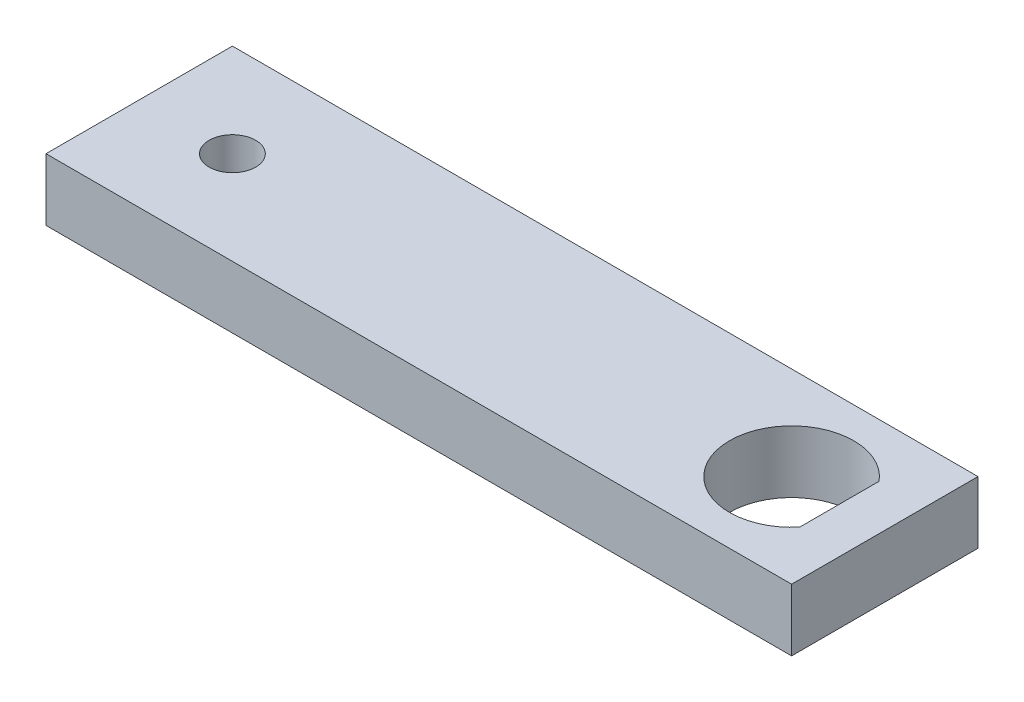
ISO-10303-21;
HEADER;
FILE_DESCRIPTION(('STEP AP214'),'2;1');
FILE_NAME('part.step','',(''),(''),'','','');
FILE_SCHEMA(('AUTOMOTIVE_DESIGN { 1 0 10303 214 1 1 1 1 }'));
ENDSEC;
DATA;
#1=APPLICATION_CONTEXT('core data for automotive mechanical design processes');
#2=APPLICATION_PROTOCOL_DEFINITION('international standard','automotive_design',2000,#1);
#3=PRODUCT_CONTEXT('',#1,'mechanical');
#4=PRODUCT('Part','Part','',(#3));
#5=PRODUCT_RELATED_PRODUCT_CATEGORY('part','',(#4));
#6=PRODUCT_DEFINITION_FORMATION('','',#4);
#7=PRODUCT_DEFINITION_CONTEXT('part definition',#1,'design');
#8=PRODUCT_DEFINITION('design','',#6,#7);
#9=PRODUCT_DEFINITION_SHAPE('','',#8);
#10=(LENGTH_UNIT() NAMED_UNIT(*) SI_UNIT(.MILLI.,.METRE.));
#11=(NAMED_UNIT(*) PLANE_ANGLE_UNIT() SI_UNIT($,.RADIAN.));
#12=(NAMED_UNIT(*) SI_UNIT($,.STERADIAN.) SOLID_ANGLE_UNIT());
#13=UNCERTAINTY_MEASURE_WITH_UNIT(LENGTH_MEASURE(1.E-05),#10,'distance_accuracy_value','');
#14=(GEOMETRIC_REPRESENTATION_CONTEXT(3) GLOBAL_UNCERTAINTY_ASSIGNED_CONTEXT((#13)) GLOBAL_UNIT_ASSIGNED_CONTEXT((#10,
#11,#12)) REPRESENTATION_CONTEXT('',''));
#15=CARTESIAN_POINT('',(0.,0.,0.));
#16=DIRECTION('',(0.,0.,1.));
#17=DIRECTION('',(1.,0.,0.));
#18=AXIS2_PLACEMENT_3D('',#15,#16,#17);
#19=CARTESIAN_POINT('',(0.,0.,19.05));
#20=DIRECTION('',(-1.,0.,0.));
#21=DIRECTION('',(0.,0.,1.));
#22=AXIS2_PLACEMENT_3D('',#19,#20,#21);
#23=PLANE('',#22);
#24=DIRECTION('',(0.,1.,0.));
#25=VECTOR('',#24,1.);
#26=CARTESIAN_POINT('',(0.,0.,0.));
#27=LINE('',#26,#25);
#28=CARTESIAN_POINT('',(0.,0.,0.));
#29=VERTEX_POINT('',#28);
#30=CARTESIAN_POINT('',(0.,6.35000000000001,0.));
#31=VERTEX_POINT('',#30);
#32=EDGE_CURVE('E111',#29,#31,#27,.T.);
#33=ORIENTED_EDGE('',*,*,#32,.F.);
#34=DIRECTION('',(0.,0.,-1.));
#35=VECTOR('',#34,1.);
#36=CARTESIAN_POINT('',(0.,0.,19.05));
#37=LINE('',#36,#35);
#38=CARTESIAN_POINT('',(0.,0.,19.05));
#39=VERTEX_POINT('',#38);
#40=EDGE_CURVE('E11',#39,#29,#37,.T.);
#41=ORIENTED_EDGE('',*,*,#40,.F.);
#42=DIRECTION('',(0.,1.,0.));
#43=VECTOR('',#42,1.);
#44=CARTESIAN_POINT('',(0.,0.,19.05));
#45=LINE('',#44,#43);
#46=CARTESIAN_POINT('',(0.,6.35000000000001,19.05));
#47=VERTEX_POINT('',#46);
#48=EDGE_CURVE('E113',#39,#47,#45,.T.);
#49=ORIENTED_EDGE('',*,*,#48,.T.);
#50=DIRECTION('',(0.,0.,-1.));
#51=VECTOR('',#50,1.);
#52=CARTESIAN_POINT('',(0.,6.35000000000001,19.05));
#53=LINE('',#52,#51);
#54=EDGE_CURVE('E41',#47,#31,#53,.T.);
#55=ORIENTED_EDGE('',*,*,#54,.T.);
#56=EDGE_LOOP('',(#33,#41,#49,#55));
#57=FACE_BOUND('',#56,.T.);
#58=ADVANCED_FACE('F38',(#57),#23,.T.);
#59=CARTESIAN_POINT('',(0.,0.,19.05));
#60=DIRECTION('',(0.,1.,0.));
#61=DIRECTION('',(0.,0.,1.));
#62=AXIS2_PLACEMENT_3D('',#59,#60,#61);
#63=PLANE('',#62);
#64=CARTESIAN_POINT('',(9.525,0.,9.525));
#65=DIRECTION('',(0.,1.,0.));
#66=DIRECTION('',(-1.,0.,0.));
#67=AXIS2_PLACEMENT_3D('',#64,#65,#66);
#68=CIRCLE('',#67,2.38125);
#69=CARTESIAN_POINT('',(7.14375,0.,9.525));
#70=VERTEX_POINT('',#69);
#71=EDGE_CURVE('E109',#70,#70,#68,.T.);
#72=ORIENTED_EDGE('',*,*,#71,.T.);
#73=EDGE_LOOP('',(#72));
#74=FACE_BOUND('',#73,.T.);
#75=DIRECTION('',(0.,0.,1.));
#76=VECTOR('',#75,1.);
#77=CARTESIAN_POINT('',(71.5645,0.,5.47342132619889));
#78=LINE('',#77,#76);
#79=CARTESIAN_POINT('',(71.5645,0.,5.47342132619889));
#80=VERTEX_POINT('',#79);
#81=CARTESIAN_POINT('',(71.5645,0.,13.5765786738011));
#82=VERTEX_POINT('',#81);
#83=EDGE_CURVE('E90',#80,#82,#78,.T.);
#84=ORIENTED_EDGE('',*,*,#83,.F.);
#85=CARTESIAN_POINT('',(66.675,0.,9.525));
#86=DIRECTION('',(0.,1.,0.));
#87=DIRECTION('',(-1.,0.,0.));
#88=AXIS2_PLACEMENT_3D('',#85,#86,#87);
#89=CIRCLE('',#88,6.35);
#90=EDGE_CURVE('E54',#80,#82,#89,.T.);
#91=ORIENTED_EDGE('',*,*,#90,.T.);
#92=EDGE_LOOP('',(#84,#91));
#93=FACE_BOUND('',#92,.T.);
#94=DIRECTION('',(1.,0.,0.));
#95=VECTOR('',#94,1.);
#96=CARTESIAN_POINT('',(0.,0.,0.));
#97=LINE('',#96,#95);
#98=CARTESIAN_POINT('',(76.2,0.,0.));
#99=VERTEX_POINT('',#98);
#100=EDGE_CURVE('E117',#29,#99,#97,.T.);
#101=ORIENTED_EDGE('',*,*,#100,.T.);
#102=DIRECTION('',(0.,0.,-1.));
#103=VECTOR('',#102,1.);
#104=CARTESIAN_POINT('',(76.2,0.,19.05));
#105=LINE('',#104,#103);
#106=CARTESIAN_POINT('',(76.2,0.,19.05));
#107=VERTEX_POINT('',#106);
#108=EDGE_CURVE('E46',#107,#99,#105,.T.);
#109=ORIENTED_EDGE('',*,*,#108,.F.);
#110=DIRECTION('',(1.,0.,0.));
#111=VECTOR('',#110,1.);
#112=CARTESIAN_POINT('',(0.,0.,19.05));
#113=LINE('',#112,#111);
#114=EDGE_CURVE('E122',#39,#107,#113,.T.);
#115=ORIENTED_EDGE('',*,*,#114,.F.);
#116=ORIENTED_EDGE('',*,*,#40,.T.);
#117=EDGE_LOOP('',(#101,#109,#115,#116));
#118=FACE_BOUND('',#117,.T.);
#119=ADVANCED_FACE('F100',(#74,#93,#118),#63,.F.);
#120=CARTESIAN_POINT('',(76.2,6.34999999999999,19.05));
#121=DIRECTION('',(1.,0.,0.));
#122=DIRECTION('',(0.,0.,-1.));
#123=AXIS2_PLACEMENT_3D('',#120,#121,#122);
#124=PLANE('',#123);
#125=DIRECTION('',(0.,-1.,0.));
#126=VECTOR('',#125,1.);
#127=CARTESIAN_POINT('',(76.2,6.34999999999999,0.));
#128=LINE('',#127,#126);
#129=CARTESIAN_POINT('',(76.2,6.34999999999999,0.));
#130=VERTEX_POINT('',#129);
#131=EDGE_CURVE('E129',#130,#99,#128,.T.);
#132=ORIENTED_EDGE('',*,*,#131,.F.);
#133=DIRECTION('',(0.,0.,-1.));
#134=VECTOR('',#133,1.);
#135=CARTESIAN_POINT('',(76.2,6.34999999999999,19.05));
#136=LINE('',#135,#134);
#137=CARTESIAN_POINT('',(76.2,6.34999999999999,19.05));
#138=VERTEX_POINT('',#137);
#139=EDGE_CURVE('E135',#138,#130,#136,.T.);
#140=ORIENTED_EDGE('',*,*,#139,.F.);
#141=DIRECTION('',(0.,-1.,0.));
#142=VECTOR('',#141,1.);
#143=CARTESIAN_POINT('',(76.2,6.34999999999999,19.05));
#144=LINE('',#143,#142);
#145=EDGE_CURVE('E119',#138,#107,#144,.T.);
#146=ORIENTED_EDGE('',*,*,#145,.T.);
#147=ORIENTED_EDGE('',*,*,#108,.T.);
#148=EDGE_LOOP('',(#132,#140,#146,#147));
#149=FACE_BOUND('',#148,.T.);
#150=ADVANCED_FACE('F154',(#149),#124,.T.);
#151=CARTESIAN_POINT('',(76.2,6.34999999999999,19.05));
#152=DIRECTION('',(0.,-1.,0.));
#153=DIRECTION('',(1.,0.,0.));
#154=AXIS2_PLACEMENT_3D('',#151,#152,#153);
#155=PLANE('',#154);
#156=CARTESIAN_POINT('',(9.525,6.35000000000001,9.525));
#157=DIRECTION('',(0.,1.,0.));
#158=DIRECTION('',(-1.,0.,0.));
#159=AXIS2_PLACEMENT_3D('',#156,#157,#158);
#160=CIRCLE('',#159,2.38125);
#161=CARTESIAN_POINT('',(7.14375,6.35000000000001,9.525));
#162=VERTEX_POINT('',#161);
#163=EDGE_CURVE('E106',#162,#162,#160,.T.);
#164=ORIENTED_EDGE('',*,*,#163,.F.);
#165=EDGE_LOOP('',(#164));
#166=FACE_BOUND('',#165,.T.);
#167=DIRECTION('',(0.,0.,1.));
#168=VECTOR('',#167,1.);
#169=CARTESIAN_POINT('',(71.5645,6.35,5.47342132619889));
#170=LINE('',#169,#168);
#171=CARTESIAN_POINT('',(71.5645,6.35,5.47342132619889));
#172=VERTEX_POINT('',#171);
#173=CARTESIAN_POINT('',(71.5645,6.34999999999999,13.5765786738011));
#174=VERTEX_POINT('',#173);
#175=EDGE_CURVE('E102',#172,#174,#170,.T.);
#176=ORIENTED_EDGE('',*,*,#175,.T.);
#177=CARTESIAN_POINT('',(66.675,6.35,9.525));
#178=DIRECTION('',(0.,1.,0.));
#179=DIRECTION('',(-1.,0.,0.));
#180=AXIS2_PLACEMENT_3D('',#177,#178,#179);
#181=CIRCLE('',#180,6.35);
#182=EDGE_CURVE('E59',#172,#174,#181,.T.);
#183=ORIENTED_EDGE('',*,*,#182,.F.);
#184=EDGE_LOOP('',(#176,#183));
#185=FACE_BOUND('',#184,.T.);
#186=DIRECTION('',(-1.,0.,0.));
#187=VECTOR('',#186,1.);
#188=CARTESIAN_POINT('',(76.2,6.34999999999999,0.));
#189=LINE('',#188,#187);
#190=EDGE_CURVE('E126',#130,#31,#189,.T.);
#191=ORIENTED_EDGE('',*,*,#190,.T.);
#192=ORIENTED_EDGE('',*,*,#54,.F.);
#193=DIRECTION('',(-1.,0.,0.));
#194=VECTOR('',#193,1.);
#195=CARTESIAN_POINT('',(76.2,6.34999999999999,19.05));
#196=LINE('',#195,#194);
#197=EDGE_CURVE('E116',#138,#47,#196,.T.);
#198=ORIENTED_EDGE('',*,*,#197,.F.);
#199=ORIENTED_EDGE('',*,*,#139,.T.);
#200=EDGE_LOOP('',(#191,#192,#198,#199));
#201=FACE_BOUND('',#200,.T.);
#202=ADVANCED_FACE('F143',(#166,#185,#201),#155,.F.);
#203=CARTESIAN_POINT('',(0.,0.,19.05));
#204=DIRECTION('',(0.,0.,-1.));
#205=DIRECTION('',(-1.,0.,0.));
#206=AXIS2_PLACEMENT_3D('',#203,#204,#205);
#207=PLANE('',#206);
#208=ORIENTED_EDGE('',*,*,#48,.F.);
#209=ORIENTED_EDGE('',*,*,#114,.T.);
#210=ORIENTED_EDGE('',*,*,#145,.F.);
#211=ORIENTED_EDGE('',*,*,#197,.T.);
#212=EDGE_LOOP('',(#208,#209,#210,#211));
#213=FACE_BOUND('',#212,.T.);
#214=ADVANCED_FACE('F152',(#213),#207,.F.);
#215=CARTESIAN_POINT('',(0.,0.,0.));
#216=DIRECTION('',(0.,0.,-1.));
#217=DIRECTION('',(-1.,0.,0.));
#218=AXIS2_PLACEMENT_3D('',#215,#216,#217);
#219=PLANE('',#218);
#220=ORIENTED_EDGE('',*,*,#32,.T.);
#221=ORIENTED_EDGE('',*,*,#190,.F.);
#222=ORIENTED_EDGE('',*,*,#131,.T.);
#223=ORIENTED_EDGE('',*,*,#100,.F.);
#224=EDGE_LOOP('',(#220,#221,#222,#223));
#225=FACE_BOUND('',#224,.T.);
#226=ADVANCED_FACE('F147',(#225),#219,.T.);
#227=CARTESIAN_POINT('',(66.675,0.,9.525));
#228=DIRECTION('',(0.,1.,0.));
#229=DIRECTION('',(-1.,0.,0.));
#230=AXIS2_PLACEMENT_3D('',#227,#228,#229);
#231=CYLINDRICAL_SURFACE('',#230,6.35);
#232=ORIENTED_EDGE('',*,*,#182,.T.);
#233=DIRECTION('',(0.,1.,0.));
#234=VECTOR('',#233,1.);
#235=CARTESIAN_POINT('',(71.5645,0.,13.5765786738011));
#236=LINE('',#235,#234);
#237=EDGE_CURVE('E93',#82,#174,#236,.T.);
#238=ORIENTED_EDGE('',*,*,#237,.F.);
#239=ORIENTED_EDGE('',*,*,#90,.F.);
#240=DIRECTION('',(0.,1.,0.));
#241=VECTOR('',#240,1.);
#242=CARTESIAN_POINT('',(71.5645,0.,5.47342132619889));
#243=LINE('',#242,#241);
#244=EDGE_CURVE('E95',#80,#172,#243,.T.);
#245=ORIENTED_EDGE('',*,*,#244,.T.);
#246=EDGE_LOOP('',(#232,#238,#239,#245));
#247=FACE_BOUND('',#246,.T.);
#248=ADVANCED_FACE('F98',(#247),#231,.F.);
#249=CARTESIAN_POINT('',(71.5645,0.,5.47342132619889));
#250=DIRECTION('',(-1.,0.,0.));
#251=DIRECTION('',(0.,-1.,0.));
#252=AXIS2_PLACEMENT_3D('',#249,#250,#251);
#253=PLANE('',#252);
#254=ORIENTED_EDGE('',*,*,#175,.F.);
#255=ORIENTED_EDGE('',*,*,#244,.F.);
#256=ORIENTED_EDGE('',*,*,#83,.T.);
#257=ORIENTED_EDGE('',*,*,#237,.T.);
#258=EDGE_LOOP('',(#254,#255,#256,#257));
#259=FACE_BOUND('',#258,.T.);
#260=ADVANCED_FACE('F92',(#259),#253,.T.);
#261=CARTESIAN_POINT('',(9.525,0.,9.525));
#262=DIRECTION('',(0.,1.,0.));
#263=DIRECTION('',(-1.,0.,0.));
#264=AXIS2_PLACEMENT_3D('',#261,#262,#263);
#265=CYLINDRICAL_SURFACE('',#264,2.38125);
#266=CARTESIAN_POINT('',(7.14375,0.,9.525));
#267=CARTESIAN_POINT('',(7.14375,0.0661458333333243,9.525));
#268=CARTESIAN_POINT('',(7.14375,0.132291666666658,9.525));
#269=CARTESIAN_POINT('',(7.14375,0.264583333333325,9.525));
#270=CARTESIAN_POINT('',(7.14375,0.330729166666659,9.525));
#271=CARTESIAN_POINT('',(7.14375,0.463020833333326,9.525));
#272=CARTESIAN_POINT('',(7.14375,0.529166666666659,9.525));
#273=CARTESIAN_POINT('',(7.14375,0.661458333333326,9.525));
#274=CARTESIAN_POINT('',(7.14375,0.72760416666666,9.525));
#275=CARTESIAN_POINT('',(7.14375,0.859895833333327,9.525));
#276=CARTESIAN_POINT('',(7.14375,0.926041666666661,9.525));
#277=CARTESIAN_POINT('',(7.14375,1.05833333333333,9.525));
#278=CARTESIAN_POINT('',(7.14375,1.12447916666666,9.525));
#279=CARTESIAN_POINT('',(7.14375,1.25677083333333,9.525));
#280=CARTESIAN_POINT('',(7.14375,1.32291666666666,9.525));
#281=CARTESIAN_POINT('',(7.14375,1.45520833333333,9.525));
#282=CARTESIAN_POINT('',(7.14375,1.52135416666666,9.525));
#283=CARTESIAN_POINT('',(7.14375,1.65364583333333,9.525));
#284=CARTESIAN_POINT('',(7.14375,1.71979166666666,9.525));
#285=CARTESIAN_POINT('',(7.14375,1.85208333333333,9.525));
#286=CARTESIAN_POINT('',(7.14375,1.91822916666666,9.525));
#287=CARTESIAN_POINT('',(7.14375,2.05052083333333,9.525));
#288=CARTESIAN_POINT('',(7.14375,2.11666666666666,9.525));
#289=CARTESIAN_POINT('',(7.14375,2.24895833333333,9.525));
#290=CARTESIAN_POINT('',(7.14375,2.31510416666667,9.525));
#291=CARTESIAN_POINT('',(7.14375,2.44739583333333,9.525));
#292=CARTESIAN_POINT('',(7.14375,2.51354166666667,9.525));
#293=CARTESIAN_POINT('',(7.14375,2.64583333333333,9.525));
#294=CARTESIAN_POINT('',(7.14375,2.71197916666667,9.525));
#295=CARTESIAN_POINT('',(7.14375,2.84427083333333,9.525));
#296=CARTESIAN_POINT('',(7.14375,2.91041666666667,9.525));
#297=CARTESIAN_POINT('',(7.14375,3.04270833333334,9.525));
#298=CARTESIAN_POINT('',(7.14375,3.10885416666667,9.525));
#299=CARTESIAN_POINT('',(7.14375,3.24114583333334,9.525));
#300=CARTESIAN_POINT('',(7.14375,3.30729166666667,9.525));
#301=CARTESIAN_POINT('',(7.14375,3.43958333333334,9.525));
#302=CARTESIAN_POINT('',(7.14375,3.50572916666667,9.525));
#303=CARTESIAN_POINT('',(7.14375,3.63802083333334,9.525));
#304=CARTESIAN_POINT('',(7.14375,3.70416666666667,9.525));
#305=CARTESIAN_POINT('',(7.14375,3.83645833333334,9.525));
#306=CARTESIAN_POINT('',(7.14375,3.90260416666667,9.525));
#307=CARTESIAN_POINT('',(7.14375,4.03489583333334,9.525));
#308=CARTESIAN_POINT('',(7.14375,4.10104166666667,9.525));
#309=CARTESIAN_POINT('',(7.14375,4.23333333333334,9.525));
#310=CARTESIAN_POINT('',(7.14375,4.29947916666667,9.525));
#311=CARTESIAN_POINT('',(7.14375,4.43177083333334,9.525));
#312=CARTESIAN_POINT('',(7.14375,4.49791666666667,9.525));
#313=CARTESIAN_POINT('',(7.14375,4.63020833333334,9.525));
#314=CARTESIAN_POINT('',(7.14375,4.69635416666667,9.525));
#315=CARTESIAN_POINT('',(7.14375,4.82864583333334,9.525));
#316=CARTESIAN_POINT('',(7.14375,4.89479166666668,9.525));
#317=CARTESIAN_POINT('',(7.14375,5.02708333333334,9.525));
#318=CARTESIAN_POINT('',(7.14375,5.09322916666668,9.525));
#319=CARTESIAN_POINT('',(7.14375,5.22552083333334,9.525));
#320=CARTESIAN_POINT('',(7.14375,5.29166666666668,9.525));
#321=CARTESIAN_POINT('',(7.14375,5.42395833333334,9.525));
#322=CARTESIAN_POINT('',(7.14375,5.49010416666668,9.525));
#323=CARTESIAN_POINT('',(7.14375,5.62239583333334,9.525));
#324=CARTESIAN_POINT('',(7.14375,5.68854166666668,9.525));
#325=CARTESIAN_POINT('',(7.14375,5.82083333333335,9.525));
#326=CARTESIAN_POINT('',(7.14375,5.88697916666668,9.525));
#327=CARTESIAN_POINT('',(7.14375,6.01927083333335,9.525));
#328=CARTESIAN_POINT('',(7.14375,6.08541666666668,9.525));
#329=CARTESIAN_POINT('',(7.14375,6.21770833333335,9.525));
#330=CARTESIAN_POINT('',(7.14375,6.28385416666668,9.525));
#331=CARTESIAN_POINT('',(7.14375,6.35000000000001,9.525));
#332=B_SPLINE_CURVE_WITH_KNOTS('',3,(#266,#267,#268,#269,#270,#271,#272,#273,#274,#275,#276,
#277,#278,#279,#280,#281,#282,#283,#284,#285,#286,#287,#288,#289,#290,#291,#292,#293,#294,#295,
#296,#297,#298,#299,#300,#301,#302,#303,#304,#305,#306,#307,#308,#309,#310,#311,#312,#313,#314,
#315,#316,#317,#318,#319,#320,#321,#322,#323,#324,#325,#326,#327,#328,#329,#330,#331),
.UNSPECIFIED.,.F.,.F.,(4,2,2,2,2,2,2,2,2,2,2,2,2,2,2,2,2,2,2,2,2,2,2,2,2,2,2,2,2,2,2,2,4),(0.,
0.198437500000001,0.396875000000001,0.595312500000002,0.793750000000003,0.992187500000003,
1.190625,1.38906250000001,1.58750000000001,1.78593750000001,1.98437500000001,2.18281250000001,
2.38125000000001,2.57968750000001,2.77812500000001,2.97656250000001,3.17500000000001,
3.37343750000001,3.57187500000001,3.77031250000001,3.96875000000001,4.16718750000001,
4.36562500000002,4.56406250000002,4.76250000000002,4.96093750000002,5.15937500000002,
5.35781250000002,5.55625000000002,5.75468750000002,5.95312500000002,6.15156250000002,
6.35000000000002),.UNSPECIFIED.);
#333=EDGE_CURVE('BSEAM191',#70,#162,#332,.T.);
#334=ORIENTED_EDGE('',*,*,#71,.F.);
#335=ORIENTED_EDGE('',*,*,#163,.T.);
#336=ORIENTED_EDGE('',*,*,#333,.T.);
#337=ORIENTED_EDGE('',*,*,#333,.F.);
#338=EDGE_LOOP('',(#334,#336,#335,#337));
#339=FACE_BOUND('',#338,.T.);
#340=ADVANCED_FACE('F191',(#339),#265,.F.);
#341=CLOSED_SHELL('',(#58,#119,#150,#202,#214,#226,#248,#260,#340));
#342=MANIFOLD_SOLID_BREP('B2',#341);
#343=ADVANCED_BREP_SHAPE_REPRESENTATION('',(#18,#342),#14);
#344=SHAPE_DEFINITION_REPRESENTATION(#9,#343);
ENDSEC;
END-ISO-10303-21;
